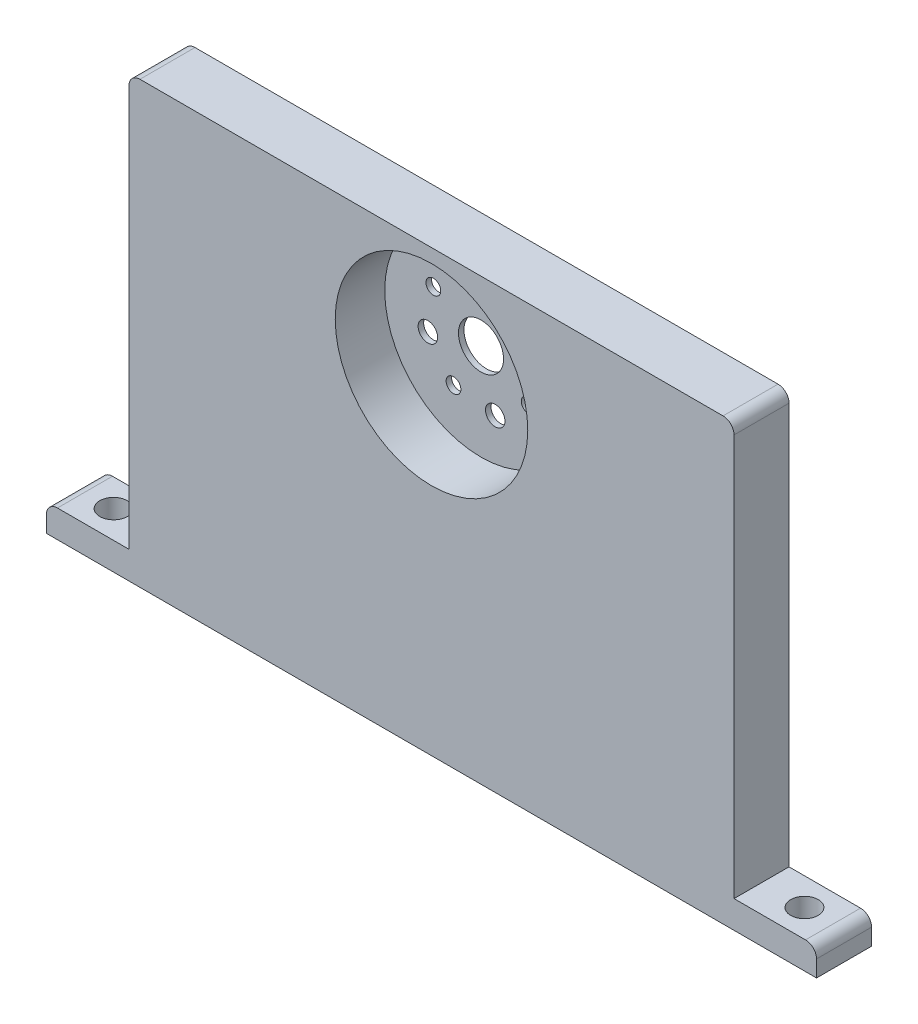
ISO-10303-21;
HEADER;
FILE_DESCRIPTION(('STEP AP214'),'2;1');
FILE_NAME('part.step','',(''),(''),'','','');
FILE_SCHEMA(('AUTOMOTIVE_DESIGN { 1 0 10303 214 1 1 1 1 }'));
ENDSEC;
DATA;
#1=APPLICATION_CONTEXT('core data for automotive mechanical design processes');
#2=APPLICATION_PROTOCOL_DEFINITION('international standard','automotive_design',2000,#1);
#3=PRODUCT_CONTEXT('',#1,'mechanical');
#4=PRODUCT('Part','Part','',(#3));
#5=PRODUCT_RELATED_PRODUCT_CATEGORY('part','',(#4));
#6=PRODUCT_DEFINITION_FORMATION('','',#4);
#7=PRODUCT_DEFINITION_CONTEXT('part definition',#1,'design');
#8=PRODUCT_DEFINITION('design','',#6,#7);
#9=PRODUCT_DEFINITION_SHAPE('','',#8);
#10=(LENGTH_UNIT() NAMED_UNIT(*) SI_UNIT(.MILLI.,.METRE.));
#11=(NAMED_UNIT(*) PLANE_ANGLE_UNIT() SI_UNIT($,.RADIAN.));
#12=(NAMED_UNIT(*) SI_UNIT($,.STERADIAN.) SOLID_ANGLE_UNIT());
#13=UNCERTAINTY_MEASURE_WITH_UNIT(LENGTH_MEASURE(1.E-05),#10,'distance_accuracy_value','');
#14=(GEOMETRIC_REPRESENTATION_CONTEXT(3) GLOBAL_UNCERTAINTY_ASSIGNED_CONTEXT((#13)) GLOBAL_UNIT_ASSIGNED_CONTEXT((#10,
#11,#12)) REPRESENTATION_CONTEXT('',''));
#15=CARTESIAN_POINT('',(0.,0.,0.));
#16=DIRECTION('',(0.,0.,1.));
#17=DIRECTION('',(1.,0.,0.));
#18=AXIS2_PLACEMENT_3D('',#15,#16,#17);
#19=CARTESIAN_POINT('',(69.85,76.2,-12.701));
#20=DIRECTION('',(0.,0.,1.));
#21=DIRECTION('',(1.,0.,0.));
#22=AXIS2_PLACEMENT_3D('',#19,#20,#21);
#23=CYLINDRICAL_SURFACE('',#22,5.20700000000001);
#24=CARTESIAN_POINT('',(69.85,76.2,-12.7));
#25=DIRECTION('',(0.,0.,1.));
#26=DIRECTION('',(1.,0.,0.));
#27=AXIS2_PLACEMENT_3D('',#24,#25,#26);
#28=CIRCLE('',#27,5.20700000000001);
#29=CARTESIAN_POINT('',(75.057,76.2,-12.7));
#30=VERTEX_POINT('',#29);
#31=EDGE_CURVE('E156',#30,#30,#28,.F.);
#32=ORIENTED_EDGE('',*,*,#31,.T.);
#33=EDGE_LOOP('',(#32));
#34=FACE_BOUND('',#33,.T.);
#35=CARTESIAN_POINT('',(69.85,76.2,-11.43));
#36=DIRECTION('',(0.,0.,1.));
#37=DIRECTION('',(1.,0.,0.));
#38=AXIS2_PLACEMENT_3D('',#35,#36,#37);
#39=CIRCLE('',#38,5.20700000000001);
#40=CARTESIAN_POINT('',(75.057,76.2,-11.43));
#41=VERTEX_POINT('',#40);
#42=EDGE_CURVE('E191',#41,#41,#39,.F.);
#43=ORIENTED_EDGE('',*,*,#42,.F.);
#44=EDGE_LOOP('',(#43));
#45=FACE_BOUND('',#44,.T.);
#46=ADVANCED_FACE('F35',(#34,#45),#23,.F.);
#47=CARTESIAN_POINT('',(0.,101.6,0.));
#48=DIRECTION('',(1.,0.,0.));
#49=DIRECTION('',(0.,0.,-1.));
#50=AXIS2_PLACEMENT_3D('',#47,#48,#49);
#51=PLANE('',#50);
#52=DIRECTION('',(0.,-1.,0.));
#53=VECTOR('',#52,1.);
#54=CARTESIAN_POINT('',(0.,101.6,0.));
#55=LINE('',#54,#53);
#56=CARTESIAN_POINT('',(0.,99.06,0.));
#57=VERTEX_POINT('',#56);
#58=CARTESIAN_POINT('',(0.,6.34999999999999,0.));
#59=VERTEX_POINT('',#58);
#60=EDGE_CURVE('E187',#57,#59,#55,.T.);
#61=ORIENTED_EDGE('',*,*,#60,.F.);
#62=DIRECTION('',(0.,0.,1.));
#63=VECTOR('',#62,1.);
#64=CARTESIAN_POINT('',(0.,99.06,0.));
#65=LINE('',#64,#63);
#66=CARTESIAN_POINT('',(0.,99.06,-12.7));
#67=VERTEX_POINT('',#66);
#68=EDGE_CURVE('E11',#57,#67,#65,.F.);
#69=ORIENTED_EDGE('',*,*,#68,.T.);
#70=DIRECTION('',(0.,-1.,0.));
#71=VECTOR('',#70,1.);
#72=CARTESIAN_POINT('',(0.,101.6,-12.7));
#73=LINE('',#72,#71);
#74=CARTESIAN_POINT('',(0.,6.34999999999999,-12.7));
#75=VERTEX_POINT('',#74);
#76=EDGE_CURVE('E179',#67,#75,#73,.T.);
#77=ORIENTED_EDGE('',*,*,#76,.T.);
#78=DIRECTION('',(0.,0.,-1.));
#79=VECTOR('',#78,1.);
#80=CARTESIAN_POINT('',(0.,6.35,0.));
#81=LINE('',#80,#79);
#82=EDGE_CURVE('E162',#59,#75,#81,.T.);
#83=ORIENTED_EDGE('',*,*,#82,.F.);
#84=EDGE_LOOP('',(#61,#69,#77,#83));
#85=FACE_BOUND('',#84,.T.);
#86=ADVANCED_FACE('F248',(#85),#51,.F.);
#87=CARTESIAN_POINT('',(0.,101.6,0.));
#88=DIRECTION('',(0.,0.,-1.));
#89=DIRECTION('',(-1.,0.,0.));
#90=AXIS2_PLACEMENT_3D('',#87,#88,#89);
#91=PLANE('',#90);
#92=CARTESIAN_POINT('',(69.85,76.2,0.));
#93=DIRECTION('',(0.,0.,1.));
#94=DIRECTION('',(1.,0.,0.));
#95=AXIS2_PLACEMENT_3D('',#92,#93,#94);
#96=CIRCLE('',#95,22.225);
#97=CARTESIAN_POINT('',(92.075,76.2,0.));
#98=VERTEX_POINT('',#97);
#99=EDGE_CURVE('E395',#98,#98,#96,.T.);
#100=ORIENTED_EDGE('',*,*,#99,.F.);
#101=EDGE_LOOP('',(#100));
#102=FACE_BOUND('',#101,.T.);
#103=DIRECTION('',(0.,1.,0.));
#104=VECTOR('',#103,1.);
#105=CARTESIAN_POINT('',(158.75,0.,0.));
#106=LINE('',#105,#104);
#107=CARTESIAN_POINT('',(158.75,0.,0.));
#108=VERTEX_POINT('',#107);
#109=CARTESIAN_POINT('',(158.75,3.81,0.));
#110=VERTEX_POINT('',#109);
#111=EDGE_CURVE('E126',#108,#110,#106,.T.);
#112=ORIENTED_EDGE('',*,*,#111,.T.);
#113=CARTESIAN_POINT('',(156.21,3.81,0.));
#114=DIRECTION('',(0.,0.,-1.));
#115=DIRECTION('',(-1.,0.,0.));
#116=AXIS2_PLACEMENT_3D('',#113,#114,#115);
#117=CIRCLE('',#116,2.54);
#118=CARTESIAN_POINT('',(156.21,6.35,0.));
#119=VERTEX_POINT('',#118);
#120=EDGE_CURVE('E211',#110,#119,#117,.F.);
#121=ORIENTED_EDGE('',*,*,#120,.T.);
#122=DIRECTION('',(-1.,0.,0.));
#123=VECTOR('',#122,1.);
#124=CARTESIAN_POINT('',(158.75,6.35,0.));
#125=LINE('',#124,#123);
#126=CARTESIAN_POINT('',(139.7,6.35,0.));
#127=VERTEX_POINT('',#126);
#128=EDGE_CURVE('E150',#119,#127,#125,.T.);
#129=ORIENTED_EDGE('',*,*,#128,.T.);
#130=DIRECTION('',(0.,-1.,0.));
#131=VECTOR('',#130,1.);
#132=CARTESIAN_POINT('',(139.7,101.6,0.));
#133=LINE('',#132,#131);
#134=CARTESIAN_POINT('',(139.7,99.06,0.));
#135=VERTEX_POINT('',#134);
#136=EDGE_CURVE('E185',#135,#127,#133,.T.);
#137=ORIENTED_EDGE('',*,*,#136,.F.);
#138=CARTESIAN_POINT('',(137.16,99.06,0.));
#139=DIRECTION('',(0.,0.,-1.));
#140=DIRECTION('',(-1.,0.,0.));
#141=AXIS2_PLACEMENT_3D('',#138,#139,#140);
#142=CIRCLE('',#141,2.54);
#143=CARTESIAN_POINT('',(137.16,101.6,0.));
#144=VERTEX_POINT('',#143);
#145=EDGE_CURVE('E208',#135,#144,#142,.F.);
#146=ORIENTED_EDGE('',*,*,#145,.T.);
#147=DIRECTION('',(1.,0.,0.));
#148=VECTOR('',#147,1.);
#149=CARTESIAN_POINT('',(0.,101.6,0.));
#150=LINE('',#149,#148);
#151=CARTESIAN_POINT('',(2.54,101.6,0.));
#152=VERTEX_POINT('',#151);
#153=EDGE_CURVE('E174',#152,#144,#150,.T.);
#154=ORIENTED_EDGE('',*,*,#153,.F.);
#155=CARTESIAN_POINT('',(2.54,99.06,0.));
#156=DIRECTION('',(0.,0.,-1.));
#157=DIRECTION('',(-1.,0.,0.));
#158=AXIS2_PLACEMENT_3D('',#155,#156,#157);
#159=CIRCLE('',#158,2.54);
#160=EDGE_CURVE('E206',#152,#57,#159,.F.);
#161=ORIENTED_EDGE('',*,*,#160,.T.);
#162=ORIENTED_EDGE('',*,*,#60,.T.);
#163=DIRECTION('',(1.,0.,0.));
#164=VECTOR('',#163,1.);
#165=CARTESIAN_POINT('',(-19.05,6.35,0.));
#166=LINE('',#165,#164);
#167=CARTESIAN_POINT('',(-16.51,6.35,0.));
#168=VERTEX_POINT('',#167);
#169=EDGE_CURVE('E134',#168,#59,#166,.T.);
#170=ORIENTED_EDGE('',*,*,#169,.F.);
#171=CARTESIAN_POINT('',(-16.51,3.81,0.));
#172=DIRECTION('',(0.,0.,-1.));
#173=DIRECTION('',(-1.,0.,0.));
#174=AXIS2_PLACEMENT_3D('',#171,#172,#173);
#175=CIRCLE('',#174,2.54);
#176=CARTESIAN_POINT('',(-19.05,3.81,0.));
#177=VERTEX_POINT('',#176);
#178=EDGE_CURVE('E50',#168,#177,#175,.F.);
#179=ORIENTED_EDGE('',*,*,#178,.T.);
#180=DIRECTION('',(0.,1.,0.));
#181=VECTOR('',#180,1.);
#182=CARTESIAN_POINT('',(-19.05,0.,0.));
#183=LINE('',#182,#181);
#184=CARTESIAN_POINT('',(-19.05,0.,0.));
#185=VERTEX_POINT('',#184);
#186=EDGE_CURVE('E128',#185,#177,#183,.T.);
#187=ORIENTED_EDGE('',*,*,#186,.F.);
#188=DIRECTION('',(1.,0.,0.));
#189=VECTOR('',#188,1.);
#190=CARTESIAN_POINT('',(0.,0.,0.));
#191=LINE('',#190,#189);
#192=EDGE_CURVE('E123',#185,#108,#191,.T.);
#193=ORIENTED_EDGE('',*,*,#192,.T.);
#194=EDGE_LOOP('',(#112,#121,#129,#137,#146,#154,#161,#162,#170,#179,#187,#193));
#195=FACE_BOUND('',#194,.T.);
#196=ADVANCED_FACE('F125',(#102,#195),#91,.F.);
#197=CARTESIAN_POINT('',(139.7,101.6,0.));
#198=DIRECTION('',(-1.,0.,0.));
#199=DIRECTION('',(0.,0.,1.));
#200=AXIS2_PLACEMENT_3D('',#197,#198,#199);
#201=PLANE('',#200);
#202=DIRECTION('',(0.,-1.,0.));
#203=VECTOR('',#202,1.);
#204=CARTESIAN_POINT('',(139.7,101.6,-12.7));
#205=LINE('',#204,#203);
#206=CARTESIAN_POINT('',(139.7,99.06,-12.7));
#207=VERTEX_POINT('',#206);
#208=CARTESIAN_POINT('',(139.7,6.34999999999999,-12.7));
#209=VERTEX_POINT('',#208);
#210=EDGE_CURVE('E183',#207,#209,#205,.T.);
#211=ORIENTED_EDGE('',*,*,#210,.F.);
#212=DIRECTION('',(0.,0.,-1.));
#213=VECTOR('',#212,1.);
#214=CARTESIAN_POINT('',(139.7,99.06,0.));
#215=LINE('',#214,#213);
#216=EDGE_CURVE('E43',#207,#135,#215,.F.);
#217=ORIENTED_EDGE('',*,*,#216,.T.);
#218=ORIENTED_EDGE('',*,*,#136,.T.);
#219=DIRECTION('',(0.,0.,-1.));
#220=VECTOR('',#219,1.);
#221=CARTESIAN_POINT('',(139.7,6.35,0.));
#222=LINE('',#221,#220);
#223=EDGE_CURVE('E143',#127,#209,#222,.T.);
#224=ORIENTED_EDGE('',*,*,#223,.T.);
#225=EDGE_LOOP('',(#211,#217,#218,#224));
#226=FACE_BOUND('',#225,.T.);
#227=ADVANCED_FACE('F226',(#226),#201,.F.);
#228=CARTESIAN_POINT('',(0.,101.6,-12.7));
#229=DIRECTION('',(0.,0.,1.));
#230=DIRECTION('',(1.,0.,0.));
#231=AXIS2_PLACEMENT_3D('',#228,#229,#230);
#232=PLANE('',#231);
#233=CARTESIAN_POINT('',(66.5629981271979,88.4672579938711,-12.7));
#234=DIRECTION('',(0.,0.,1.));
#235=DIRECTION('',(1.,0.,0.));
#236=AXIS2_PLACEMENT_3D('',#233,#234,#235);
#237=CIRCLE('',#236,2.24789999999996);
#238=CARTESIAN_POINT('',(68.8108981271979,88.4672579938711,-12.7));
#239=VERTEX_POINT('',#238);
#240=EDGE_CURVE('E369',#239,#239,#237,.F.);
#241=ORIENTED_EDGE('',*,*,#240,.F.);
#242=EDGE_LOOP('',(#241));
#243=FACE_BOUND('',#242,.T.);
#244=CARTESIAN_POINT('',(82.1172579938711,79.4870018728021,-12.7));
#245=DIRECTION('',(0.,0.,1.));
#246=DIRECTION('',(1.,0.,0.));
#247=AXIS2_PLACEMENT_3D('',#244,#245,#246);
#248=CIRCLE('',#247,2.24789999999986);
#249=CARTESIAN_POINT('',(84.365157993871,79.4870018728021,-12.7));
#250=VERTEX_POINT('',#249);
#251=EDGE_CURVE('E370',#250,#250,#248,.F.);
#252=ORIENTED_EDGE('',*,*,#251,.F.);
#253=EDGE_LOOP('',(#252));
#254=FACE_BOUND('',#253,.T.);
#255=CARTESIAN_POINT('',(73.1370018728021,63.9327420061289,-12.7));
#256=DIRECTION('',(0.,0.,1.));
#257=DIRECTION('',(1.,0.,0.));
#258=AXIS2_PLACEMENT_3D('',#255,#256,#257);
#259=CIRCLE('',#258,2.24789999999999);
#260=CARTESIAN_POINT('',(75.3849018728021,63.9327420061289,-12.7));
#261=VERTEX_POINT('',#260);
#262=EDGE_CURVE('E377',#261,#261,#259,.F.);
#263=ORIENTED_EDGE('',*,*,#262,.F.);
#264=EDGE_LOOP('',(#263));
#265=FACE_BOUND('',#264,.T.);
#266=CARTESIAN_POINT('',(57.5827420061288,72.9129981271979,-12.7));
#267=DIRECTION('',(0.,0.,1.));
#268=DIRECTION('',(1.,0.,0.));
#269=AXIS2_PLACEMENT_3D('',#266,#267,#268);
#270=CIRCLE('',#269,2.24789999999992);
#271=CARTESIAN_POINT('',(59.8306420061288,72.9129981271979,-12.7));
#272=VERTEX_POINT('',#271);
#273=EDGE_CURVE('E383',#272,#272,#270,.F.);
#274=ORIENTED_EDGE('',*,*,#273,.F.);
#275=EDGE_LOOP('',(#274));
#276=FACE_BOUND('',#275,.T.);
#277=CARTESIAN_POINT('',(76.1999999999999,87.1985226280624,-12.7));
#278=DIRECTION('',(0.,0.,1.));
#279=DIRECTION('',(1.,0.,0.));
#280=AXIS2_PLACEMENT_3D('',#277,#278,#279);
#281=CIRCLE('',#280,1.70179999999997);
#282=CARTESIAN_POINT('',(77.9017999999999,87.1985226280624,-12.7));
#283=VERTEX_POINT('',#282);
#284=EDGE_CURVE('E351',#283,#283,#281,.F.);
#285=ORIENTED_EDGE('',*,*,#284,.F.);
#286=EDGE_LOOP('',(#285));
#287=FACE_BOUND('',#286,.T.);
#288=CARTESIAN_POINT('',(80.8485226280624,69.8500000000001,-12.7));
#289=DIRECTION('',(0.,0.,1.));
#290=DIRECTION('',(1.,0.,0.));
#291=AXIS2_PLACEMENT_3D('',#288,#289,#290);
#292=CIRCLE('',#291,1.7018);
#293=CARTESIAN_POINT('',(82.5503226280624,69.8500000000001,-12.7));
#294=VERTEX_POINT('',#293);
#295=EDGE_CURVE('E352',#294,#294,#292,.F.);
#296=ORIENTED_EDGE('',*,*,#295,.F.);
#297=EDGE_LOOP('',(#296));
#298=FACE_BOUND('',#297,.T.);
#299=CARTESIAN_POINT('',(63.5,65.2014773719376,-12.7));
#300=DIRECTION('',(0.,0.,1.));
#301=DIRECTION('',(1.,0.,0.));
#302=AXIS2_PLACEMENT_3D('',#299,#300,#301);
#303=CIRCLE('',#302,1.7018000000001);
#304=CARTESIAN_POINT('',(65.2018000000001,65.2014773719376,-12.7));
#305=VERTEX_POINT('',#304);
#306=EDGE_CURVE('E359',#305,#305,#303,.F.);
#307=ORIENTED_EDGE('',*,*,#306,.F.);
#308=EDGE_LOOP('',(#307));
#309=FACE_BOUND('',#308,.T.);
#310=CARTESIAN_POINT('',(58.8514773719376,82.5499999999999,-12.7));
#311=DIRECTION('',(0.,0.,1.));
#312=DIRECTION('',(1.,0.,0.));
#313=AXIS2_PLACEMENT_3D('',#310,#311,#312);
#314=CIRCLE('',#313,1.70179999999998);
#315=CARTESIAN_POINT('',(60.5532773719376,82.5499999999999,-12.7));
#316=VERTEX_POINT('',#315);
#317=EDGE_CURVE('E392',#316,#316,#314,.F.);
#318=ORIENTED_EDGE('',*,*,#317,.F.);
#319=EDGE_LOOP('',(#318));
#320=FACE_BOUND('',#319,.T.);
#321=ORIENTED_EDGE('',*,*,#31,.F.);
#322=EDGE_LOOP('',(#321));
#323=FACE_BOUND('',#322,.T.);
#324=DIRECTION('',(-1.,0.,0.));
#325=VECTOR('',#324,1.);
#326=CARTESIAN_POINT('',(158.75,6.34999999999999,-12.7));
#327=LINE('',#326,#325);
#328=CARTESIAN_POINT('',(156.21,6.34999999999999,-12.7));
#329=VERTEX_POINT('',#328);
#330=EDGE_CURVE('E159',#329,#209,#327,.T.);
#331=ORIENTED_EDGE('',*,*,#330,.F.);
#332=CARTESIAN_POINT('',(156.21,3.80999999999999,-12.7));
#333=DIRECTION('',(0.,0.,1.));
#334=DIRECTION('',(1.,0.,0.));
#335=AXIS2_PLACEMENT_3D('',#332,#333,#334);
#336=CIRCLE('',#335,2.54);
#337=CARTESIAN_POINT('',(158.75,3.80999999999999,-12.7));
#338=VERTEX_POINT('',#337);
#339=EDGE_CURVE('E203',#329,#338,#336,.F.);
#340=ORIENTED_EDGE('',*,*,#339,.T.);
#341=DIRECTION('',(0.,-1.,0.));
#342=VECTOR('',#341,1.);
#343=CARTESIAN_POINT('',(158.75,0.,-12.7));
#344=LINE('',#343,#342);
#345=CARTESIAN_POINT('',(158.75,0.,-12.7));
#346=VERTEX_POINT('',#345);
#347=EDGE_CURVE('E148',#338,#346,#344,.T.);
#348=ORIENTED_EDGE('',*,*,#347,.T.);
#349=DIRECTION('',(-1.,0.,0.));
#350=VECTOR('',#349,1.);
#351=CARTESIAN_POINT('',(0.,0.,-12.7));
#352=LINE('',#351,#350);
#353=CARTESIAN_POINT('',(-19.05,0.,-12.7));
#354=VERTEX_POINT('',#353);
#355=EDGE_CURVE('E133',#346,#354,#352,.T.);
#356=ORIENTED_EDGE('',*,*,#355,.T.);
#357=DIRECTION('',(0.,-1.,0.));
#358=VECTOR('',#357,1.);
#359=CARTESIAN_POINT('',(-19.05,0.,-12.7));
#360=LINE('',#359,#358);
#361=CARTESIAN_POINT('',(-19.05,3.80999999999999,-12.7));
#362=VERTEX_POINT('',#361);
#363=EDGE_CURVE('E164',#362,#354,#360,.T.);
#364=ORIENTED_EDGE('',*,*,#363,.F.);
#365=CARTESIAN_POINT('',(-16.51,3.80999999999999,-12.7));
#366=DIRECTION('',(0.,0.,1.));
#367=DIRECTION('',(1.,0.,0.));
#368=AXIS2_PLACEMENT_3D('',#365,#366,#367);
#369=CIRCLE('',#368,2.54);
#370=CARTESIAN_POINT('',(-16.51,6.34999999999999,-12.7));
#371=VERTEX_POINT('',#370);
#372=EDGE_CURVE('E201',#362,#371,#369,.F.);
#373=ORIENTED_EDGE('',*,*,#372,.T.);
#374=DIRECTION('',(1.,0.,0.));
#375=VECTOR('',#374,1.);
#376=CARTESIAN_POINT('',(-19.05,6.34999999999999,-12.7));
#377=LINE('',#376,#375);
#378=EDGE_CURVE('E168',#371,#75,#377,.T.);
#379=ORIENTED_EDGE('',*,*,#378,.T.);
#380=ORIENTED_EDGE('',*,*,#76,.F.);
#381=CARTESIAN_POINT('',(2.54,99.06,-12.7));
#382=DIRECTION('',(0.,0.,1.));
#383=DIRECTION('',(1.,0.,0.));
#384=AXIS2_PLACEMENT_3D('',#381,#382,#383);
#385=CIRCLE('',#384,2.54);
#386=CARTESIAN_POINT('',(2.54,101.6,-12.7));
#387=VERTEX_POINT('',#386);
#388=EDGE_CURVE('E197',#67,#387,#385,.F.);
#389=ORIENTED_EDGE('',*,*,#388,.T.);
#390=DIRECTION('',(-1.,0.,0.));
#391=VECTOR('',#390,1.);
#392=CARTESIAN_POINT('',(0.,101.6,-12.7));
#393=LINE('',#392,#391);
#394=CARTESIAN_POINT('',(137.16,101.6,-12.7));
#395=VERTEX_POINT('',#394);
#396=EDGE_CURVE('E177',#395,#387,#393,.T.);
#397=ORIENTED_EDGE('',*,*,#396,.F.);
#398=CARTESIAN_POINT('',(137.16,99.06,-12.7));
#399=DIRECTION('',(0.,0.,1.));
#400=DIRECTION('',(1.,0.,0.));
#401=AXIS2_PLACEMENT_3D('',#398,#399,#400);
#402=CIRCLE('',#401,2.54);
#403=EDGE_CURVE('E199',#395,#207,#402,.F.);
#404=ORIENTED_EDGE('',*,*,#403,.T.);
#405=ORIENTED_EDGE('',*,*,#210,.T.);
#406=EDGE_LOOP('',(#331,#340,#348,#356,#364,#373,#379,#380,#389,#397,#404,#405));
#407=FACE_BOUND('',#406,.T.);
#408=ADVANCED_FACE('F240',(#243,#254,#265,#276,#287,#298,#309,#320,#323,#407),#232,.F.);
#409=CARTESIAN_POINT('',(0.,101.6,0.));
#410=DIRECTION('',(0.,-1.,0.));
#411=DIRECTION('',(0.,0.,-1.));
#412=AXIS2_PLACEMENT_3D('',#409,#410,#411);
#413=PLANE('',#412);
#414=ORIENTED_EDGE('',*,*,#153,.T.);
#415=DIRECTION('',(0.,0.,-1.));
#416=VECTOR('',#415,1.);
#417=CARTESIAN_POINT('',(137.16,101.6,0.));
#418=LINE('',#417,#416);
#419=EDGE_CURVE('E220',#144,#395,#418,.T.);
#420=ORIENTED_EDGE('',*,*,#419,.T.);
#421=ORIENTED_EDGE('',*,*,#396,.T.);
#422=DIRECTION('',(0.,0.,1.));
#423=VECTOR('',#422,1.);
#424=CARTESIAN_POINT('',(2.54,101.6,0.));
#425=LINE('',#424,#423);
#426=EDGE_CURVE('E217',#387,#152,#425,.T.);
#427=ORIENTED_EDGE('',*,*,#426,.T.);
#428=EDGE_LOOP('',(#414,#420,#421,#427));
#429=FACE_BOUND('',#428,.T.);
#430=ADVANCED_FACE('F236',(#429),#413,.F.);
#431=CARTESIAN_POINT('',(0.,0.,0.));
#432=DIRECTION('',(0.,-1.,0.));
#433=DIRECTION('',(0.,0.,-1.));
#434=AXIS2_PLACEMENT_3D('',#431,#432,#433);
#435=PLANE('',#434);
#436=CARTESIAN_POINT('',(149.606,0.,-6.35));
#437=DIRECTION('',(0.,-1.,0.));
#438=DIRECTION('',(0.,0.,-1.));
#439=AXIS2_PLACEMENT_3D('',#436,#437,#438);
#440=CIRCLE('',#439,3.175);
#441=CARTESIAN_POINT('',(149.606,0.,-9.525));
#442=VERTEX_POINT('',#441);
#443=EDGE_CURVE('E335',#442,#442,#440,.T.);
#444=ORIENTED_EDGE('',*,*,#443,.F.);
#445=EDGE_LOOP('',(#444));
#446=FACE_BOUND('',#445,.T.);
#447=CARTESIAN_POINT('',(-9.906,0.,-6.35));
#448=DIRECTION('',(0.,-1.,0.));
#449=DIRECTION('',(0.,0.,-1.));
#450=AXIS2_PLACEMENT_3D('',#447,#448,#449);
#451=CIRCLE('',#450,3.175);
#452=CARTESIAN_POINT('',(-9.906,0.,-9.525));
#453=VERTEX_POINT('',#452);
#454=EDGE_CURVE('E339',#453,#453,#451,.F.);
#455=ORIENTED_EDGE('',*,*,#454,.T.);
#456=EDGE_LOOP('',(#455));
#457=FACE_BOUND('',#456,.T.);
#458=ORIENTED_EDGE('',*,*,#192,.F.);
#459=DIRECTION('',(0.,0.,1.));
#460=VECTOR('',#459,1.);
#461=CARTESIAN_POINT('',(-19.05,0.,0.));
#462=LINE('',#461,#460);
#463=EDGE_CURVE('E166',#354,#185,#462,.T.);
#464=ORIENTED_EDGE('',*,*,#463,.F.);
#465=ORIENTED_EDGE('',*,*,#355,.F.);
#466=DIRECTION('',(0.,0.,1.));
#467=VECTOR('',#466,1.);
#468=CARTESIAN_POINT('',(158.75,0.,0.));
#469=LINE('',#468,#467);
#470=EDGE_CURVE('E140',#346,#108,#469,.T.);
#471=ORIENTED_EDGE('',*,*,#470,.T.);
#472=EDGE_LOOP('',(#458,#464,#465,#471));
#473=FACE_BOUND('',#472,.T.);
#474=ADVANCED_FACE('F146',(#446,#457,#473),#435,.T.);
#475=CARTESIAN_POINT('',(-19.05,6.35,0.));
#476=DIRECTION('',(0.,-1.,0.));
#477=DIRECTION('',(0.,0.,-1.));
#478=AXIS2_PLACEMENT_3D('',#475,#476,#477);
#479=PLANE('',#478);
#480=CARTESIAN_POINT('',(-9.906,6.35,-6.35));
#481=DIRECTION('',(0.,1.,0.));
#482=DIRECTION('',(0.,0.,1.));
#483=AXIS2_PLACEMENT_3D('',#480,#481,#482);
#484=CIRCLE('',#483,3.175);
#485=CARTESIAN_POINT('',(-9.906,6.35,-3.175));
#486=VERTEX_POINT('',#485);
#487=EDGE_CURVE('E342',#486,#486,#484,.T.);
#488=ORIENTED_EDGE('',*,*,#487,.F.);
#489=EDGE_LOOP('',(#488));
#490=FACE_BOUND('',#489,.T.);
#491=ORIENTED_EDGE('',*,*,#378,.F.);
#492=DIRECTION('',(0.,0.,-1.));
#493=VECTOR('',#492,1.);
#494=CARTESIAN_POINT('',(-16.51,6.35,0.));
#495=LINE('',#494,#493);
#496=EDGE_CURVE('E58',#371,#168,#495,.F.);
#497=ORIENTED_EDGE('',*,*,#496,.T.);
#498=ORIENTED_EDGE('',*,*,#169,.T.);
#499=ORIENTED_EDGE('',*,*,#82,.T.);
#500=EDGE_LOOP('',(#491,#497,#498,#499));
#501=FACE_BOUND('',#500,.T.);
#502=ADVANCED_FACE('F249',(#490,#501),#479,.F.);
#503=CARTESIAN_POINT('',(-19.05,0.,0.));
#504=DIRECTION('',(-1.,0.,0.));
#505=DIRECTION('',(0.,0.,1.));
#506=AXIS2_PLACEMENT_3D('',#503,#504,#505);
#507=PLANE('',#506);
#508=ORIENTED_EDGE('',*,*,#186,.T.);
#509=DIRECTION('',(0.,0.,-1.));
#510=VECTOR('',#509,1.);
#511=CARTESIAN_POINT('',(-19.05,3.80999999999999,-12.7));
#512=LINE('',#511,#510);
#513=EDGE_CURVE('E213',#177,#362,#512,.T.);
#514=ORIENTED_EDGE('',*,*,#513,.T.);
#515=ORIENTED_EDGE('',*,*,#363,.T.);
#516=ORIENTED_EDGE('',*,*,#463,.T.);
#517=EDGE_LOOP('',(#508,#514,#515,#516));
#518=FACE_BOUND('',#517,.T.);
#519=ADVANCED_FACE('F255',(#518),#507,.T.);
#520=CARTESIAN_POINT('',(158.75,6.35,0.));
#521=DIRECTION('',(0.,1.,0.));
#522=DIRECTION('',(0.,0.,1.));
#523=AXIS2_PLACEMENT_3D('',#520,#521,#522);
#524=PLANE('',#523);
#525=CARTESIAN_POINT('',(149.606,6.35,-6.35));
#526=DIRECTION('',(0.,-1.,0.));
#527=DIRECTION('',(0.,0.,1.));
#528=AXIS2_PLACEMENT_3D('',#525,#526,#527);
#529=CIRCLE('',#528,3.175);
#530=CARTESIAN_POINT('',(149.606,6.35,-3.175));
#531=VERTEX_POINT('',#530);
#532=EDGE_CURVE('E337',#531,#531,#529,.T.);
#533=ORIENTED_EDGE('',*,*,#532,.T.);
#534=EDGE_LOOP('',(#533));
#535=FACE_BOUND('',#534,.T.);
#536=ORIENTED_EDGE('',*,*,#128,.F.);
#537=DIRECTION('',(0.,0.,-1.));
#538=VECTOR('',#537,1.);
#539=CARTESIAN_POINT('',(156.21,6.35,0.));
#540=LINE('',#539,#538);
#541=EDGE_CURVE('E190',#119,#329,#540,.T.);
#542=ORIENTED_EDGE('',*,*,#541,.T.);
#543=ORIENTED_EDGE('',*,*,#330,.T.);
#544=ORIENTED_EDGE('',*,*,#223,.F.);
#545=EDGE_LOOP('',(#536,#542,#543,#544));
#546=FACE_BOUND('',#545,.T.);
#547=ADVANCED_FACE('F260',(#535,#546),#524,.T.);
#548=CARTESIAN_POINT('',(158.75,0.,0.));
#549=DIRECTION('',(1.,0.,0.));
#550=DIRECTION('',(0.,0.,1.));
#551=AXIS2_PLACEMENT_3D('',#548,#549,#550);
#552=PLANE('',#551);
#553=ORIENTED_EDGE('',*,*,#347,.F.);
#554=DIRECTION('',(0.,0.,-1.));
#555=VECTOR('',#554,1.);
#556=CARTESIAN_POINT('',(158.75,3.81,0.));
#557=LINE('',#556,#555);
#558=EDGE_CURVE('E142',#338,#110,#557,.F.);
#559=ORIENTED_EDGE('',*,*,#558,.T.);
#560=ORIENTED_EDGE('',*,*,#111,.F.);
#561=ORIENTED_EDGE('',*,*,#470,.F.);
#562=EDGE_LOOP('',(#553,#559,#560,#561));
#563=FACE_BOUND('',#562,.T.);
#564=ADVANCED_FACE('F139',(#563),#552,.T.);
#565=CARTESIAN_POINT('',(69.85,76.2,-11.43));
#566=DIRECTION('',(0.,0.,1.));
#567=DIRECTION('',(1.,0.,0.));
#568=AXIS2_PLACEMENT_3D('',#565,#566,#567);
#569=PLANE('',#568);
#570=CARTESIAN_POINT('',(66.5629981271979,88.4672579938711,-11.43));
#571=DIRECTION('',(0.,0.,1.));
#572=DIRECTION('',(1.,0.,0.));
#573=AXIS2_PLACEMENT_3D('',#570,#571,#572);
#574=CIRCLE('',#573,2.24789999999996);
#575=CARTESIAN_POINT('',(68.8108981271979,88.4672579938711,-11.43));
#576=VERTEX_POINT('',#575);
#577=EDGE_CURVE('E366',#576,#576,#574,.T.);
#578=ORIENTED_EDGE('',*,*,#577,.F.);
#579=EDGE_LOOP('',(#578));
#580=FACE_BOUND('',#579,.T.);
#581=CARTESIAN_POINT('',(82.1172579938711,79.4870018728021,-11.43));
#582=DIRECTION('',(0.,0.,1.));
#583=DIRECTION('',(1.,0.,0.));
#584=AXIS2_PLACEMENT_3D('',#581,#582,#583);
#585=CIRCLE('',#584,2.24789999999986);
#586=CARTESIAN_POINT('',(84.365157993871,79.4870018728021,-11.43));
#587=VERTEX_POINT('',#586);
#588=EDGE_CURVE('E374',#587,#587,#585,.T.);
#589=ORIENTED_EDGE('',*,*,#588,.F.);
#590=EDGE_LOOP('',(#589));
#591=FACE_BOUND('',#590,.T.);
#592=CARTESIAN_POINT('',(73.1370018728021,63.9327420061289,-11.43));
#593=DIRECTION('',(0.,0.,1.));
#594=DIRECTION('',(1.,0.,0.));
#595=AXIS2_PLACEMENT_3D('',#592,#593,#594);
#596=CIRCLE('',#595,2.24789999999999);
#597=CARTESIAN_POINT('',(75.3849018728021,63.9327420061289,-11.43));
#598=VERTEX_POINT('',#597);
#599=EDGE_CURVE('E380',#598,#598,#596,.T.);
#600=ORIENTED_EDGE('',*,*,#599,.F.);
#601=EDGE_LOOP('',(#600));
#602=FACE_BOUND('',#601,.T.);
#603=CARTESIAN_POINT('',(57.5827420061288,72.9129981271979,-11.43));
#604=DIRECTION('',(0.,0.,1.));
#605=DIRECTION('',(1.,0.,0.));
#606=AXIS2_PLACEMENT_3D('',#603,#604,#605);
#607=CIRCLE('',#606,2.24789999999992);
#608=CARTESIAN_POINT('',(59.8306420061288,72.9129981271979,-11.43));
#609=VERTEX_POINT('',#608);
#610=EDGE_CURVE('E355',#609,#609,#607,.T.);
#611=ORIENTED_EDGE('',*,*,#610,.F.);
#612=EDGE_LOOP('',(#611));
#613=FACE_BOUND('',#612,.T.);
#614=CARTESIAN_POINT('',(76.1999999999999,87.1985226280624,-11.43));
#615=DIRECTION('',(0.,0.,1.));
#616=DIRECTION('',(1.,0.,0.));
#617=AXIS2_PLACEMENT_3D('',#614,#615,#616);
#618=CIRCLE('',#617,1.70179999999997);
#619=CARTESIAN_POINT('',(77.9017999999999,87.1985226280624,-11.43));
#620=VERTEX_POINT('',#619);
#621=EDGE_CURVE('E348',#620,#620,#618,.T.);
#622=ORIENTED_EDGE('',*,*,#621,.F.);
#623=EDGE_LOOP('',(#622));
#624=FACE_BOUND('',#623,.T.);
#625=CARTESIAN_POINT('',(80.8485226280624,69.8500000000001,-11.43));
#626=DIRECTION('',(0.,0.,1.));
#627=DIRECTION('',(1.,0.,0.));
#628=AXIS2_PLACEMENT_3D('',#625,#626,#627);
#629=CIRCLE('',#628,1.7018);
#630=CARTESIAN_POINT('',(82.5503226280624,69.8500000000001,-11.43));
#631=VERTEX_POINT('',#630);
#632=EDGE_CURVE('E356',#631,#631,#629,.T.);
#633=ORIENTED_EDGE('',*,*,#632,.F.);
#634=EDGE_LOOP('',(#633));
#635=FACE_BOUND('',#634,.T.);
#636=CARTESIAN_POINT('',(63.5,65.2014773719376,-11.43));
#637=DIRECTION('',(0.,0.,1.));
#638=DIRECTION('',(1.,0.,0.));
#639=AXIS2_PLACEMENT_3D('',#636,#637,#638);
#640=CIRCLE('',#639,1.7018000000001);
#641=CARTESIAN_POINT('',(65.2018000000001,65.2014773719376,-11.43));
#642=VERTEX_POINT('',#641);
#643=EDGE_CURVE('E345',#642,#642,#640,.T.);
#644=ORIENTED_EDGE('',*,*,#643,.F.);
#645=EDGE_LOOP('',(#644));
#646=FACE_BOUND('',#645,.T.);
#647=CARTESIAN_POINT('',(58.8514773719376,82.5499999999999,-11.43));
#648=DIRECTION('',(0.,0.,1.));
#649=DIRECTION('',(1.,0.,0.));
#650=AXIS2_PLACEMENT_3D('',#647,#648,#649);
#651=CIRCLE('',#650,1.70179999999998);
#652=CARTESIAN_POINT('',(60.5532773719376,82.5499999999999,-11.43));
#653=VERTEX_POINT('',#652);
#654=EDGE_CURVE('E373',#653,#653,#651,.T.);
#655=ORIENTED_EDGE('',*,*,#654,.F.);
#656=EDGE_LOOP('',(#655));
#657=FACE_BOUND('',#656,.T.);
#658=CARTESIAN_POINT('',(69.85,76.2,-11.43));
#659=DIRECTION('',(0.,0.,1.));
#660=DIRECTION('',(1.,0.,0.));
#661=AXIS2_PLACEMENT_3D('',#658,#659,#660);
#662=CIRCLE('',#661,22.225);
#663=CARTESIAN_POINT('',(92.075,76.2,-11.43));
#664=VERTEX_POINT('',#663);
#665=EDGE_CURVE('E194',#664,#664,#662,.T.);
#666=ORIENTED_EDGE('',*,*,#665,.T.);
#667=EDGE_LOOP('',(#666));
#668=FACE_BOUND('',#667,.T.);
#669=ORIENTED_EDGE('',*,*,#42,.T.);
#670=EDGE_LOOP('',(#669));
#671=FACE_BOUND('',#670,.T.);
#672=ADVANCED_FACE('F268',(#580,#591,#602,#613,#624,#635,#646,#657,#668,#671),#569,.T.);
#673=CARTESIAN_POINT('',(69.85,76.2,-11.43));
#674=DIRECTION('',(0.,0.,1.));
#675=DIRECTION('',(1.,0.,0.));
#676=AXIS2_PLACEMENT_3D('',#673,#674,#675);
#677=CYLINDRICAL_SURFACE('',#676,22.225);
#678=ORIENTED_EDGE('',*,*,#665,.F.);
#679=EDGE_LOOP('',(#678));
#680=FACE_BOUND('',#679,.T.);
#681=ORIENTED_EDGE('',*,*,#99,.T.);
#682=EDGE_LOOP('',(#681));
#683=FACE_BOUND('',#682,.T.);
#684=ADVANCED_FACE('F282',(#680,#683),#677,.F.);
#685=CARTESIAN_POINT('',(58.8514773719376,82.5499999999999,-12.701));
#686=DIRECTION('',(0.,0.,1.));
#687=DIRECTION('',(1.,0.,0.));
#688=AXIS2_PLACEMENT_3D('',#685,#686,#687);
#689=CYLINDRICAL_SURFACE('',#688,1.70179999999998);
#690=ORIENTED_EDGE('',*,*,#654,.T.);
#691=EDGE_LOOP('',(#690));
#692=FACE_BOUND('',#691,.T.);
#693=ORIENTED_EDGE('',*,*,#317,.T.);
#694=EDGE_LOOP('',(#693));
#695=FACE_BOUND('',#694,.T.);
#696=ADVANCED_FACE('F285',(#692,#695),#689,.F.);
#697=CARTESIAN_POINT('',(63.5,65.2014773719376,-12.701));
#698=DIRECTION('',(0.,0.,1.));
#699=DIRECTION('',(1.,0.,0.));
#700=AXIS2_PLACEMENT_3D('',#697,#698,#699);
#701=CYLINDRICAL_SURFACE('',#700,1.7018000000001);
#702=ORIENTED_EDGE('',*,*,#643,.T.);
#703=EDGE_LOOP('',(#702));
#704=FACE_BOUND('',#703,.T.);
#705=ORIENTED_EDGE('',*,*,#306,.T.);
#706=EDGE_LOOP('',(#705));
#707=FACE_BOUND('',#706,.T.);
#708=ADVANCED_FACE('F292',(#704,#707),#701,.F.);
#709=CARTESIAN_POINT('',(80.8485226280624,69.8500000000001,-12.701));
#710=DIRECTION('',(0.,0.,1.));
#711=DIRECTION('',(1.,0.,0.));
#712=AXIS2_PLACEMENT_3D('',#709,#710,#711);
#713=CYLINDRICAL_SURFACE('',#712,1.7018);
#714=ORIENTED_EDGE('',*,*,#632,.T.);
#715=EDGE_LOOP('',(#714));
#716=FACE_BOUND('',#715,.T.);
#717=ORIENTED_EDGE('',*,*,#295,.T.);
#718=EDGE_LOOP('',(#717));
#719=FACE_BOUND('',#718,.T.);
#720=ADVANCED_FACE('F314',(#716,#719),#713,.F.);
#721=CARTESIAN_POINT('',(76.1999999999999,87.1985226280624,-12.701));
#722=DIRECTION('',(0.,0.,1.));
#723=DIRECTION('',(1.,0.,0.));
#724=AXIS2_PLACEMENT_3D('',#721,#722,#723);
#725=CYLINDRICAL_SURFACE('',#724,1.70179999999997);
#726=ORIENTED_EDGE('',*,*,#621,.T.);
#727=EDGE_LOOP('',(#726));
#728=FACE_BOUND('',#727,.T.);
#729=ORIENTED_EDGE('',*,*,#284,.T.);
#730=EDGE_LOOP('',(#729));
#731=FACE_BOUND('',#730,.T.);
#732=ADVANCED_FACE('F298',(#728,#731),#725,.F.);
#733=CARTESIAN_POINT('',(57.5827420061288,72.9129981271979,-12.701));
#734=DIRECTION('',(0.,0.,1.));
#735=DIRECTION('',(1.,0.,0.));
#736=AXIS2_PLACEMENT_3D('',#733,#734,#735);
#737=CYLINDRICAL_SURFACE('',#736,2.24789999999992);
#738=ORIENTED_EDGE('',*,*,#610,.T.);
#739=EDGE_LOOP('',(#738));
#740=FACE_BOUND('',#739,.T.);
#741=ORIENTED_EDGE('',*,*,#273,.T.);
#742=EDGE_LOOP('',(#741));
#743=FACE_BOUND('',#742,.T.);
#744=ADVANCED_FACE('F294',(#740,#743),#737,.F.);
#745=CARTESIAN_POINT('',(73.1370018728021,63.9327420061289,-12.701));
#746=DIRECTION('',(0.,0.,1.));
#747=DIRECTION('',(1.,0.,0.));
#748=AXIS2_PLACEMENT_3D('',#745,#746,#747);
#749=CYLINDRICAL_SURFACE('',#748,2.24789999999999);
#750=ORIENTED_EDGE('',*,*,#599,.T.);
#751=EDGE_LOOP('',(#750));
#752=FACE_BOUND('',#751,.T.);
#753=ORIENTED_EDGE('',*,*,#262,.T.);
#754=EDGE_LOOP('',(#753));
#755=FACE_BOUND('',#754,.T.);
#756=ADVANCED_FACE('F297',(#752,#755),#749,.F.);
#757=CARTESIAN_POINT('',(82.1172579938711,79.4870018728021,-12.701));
#758=DIRECTION('',(0.,0.,1.));
#759=DIRECTION('',(1.,0.,0.));
#760=AXIS2_PLACEMENT_3D('',#757,#758,#759);
#761=CYLINDRICAL_SURFACE('',#760,2.24789999999986);
#762=ORIENTED_EDGE('',*,*,#588,.T.);
#763=EDGE_LOOP('',(#762));
#764=FACE_BOUND('',#763,.T.);
#765=ORIENTED_EDGE('',*,*,#251,.T.);
#766=EDGE_LOOP('',(#765));
#767=FACE_BOUND('',#766,.T.);
#768=ADVANCED_FACE('F302',(#764,#767),#761,.F.);
#769=CARTESIAN_POINT('',(66.5629981271979,88.4672579938711,-12.701));
#770=DIRECTION('',(0.,0.,1.));
#771=DIRECTION('',(1.,0.,0.));
#772=AXIS2_PLACEMENT_3D('',#769,#770,#771);
#773=CYLINDRICAL_SURFACE('',#772,2.24789999999996);
#774=ORIENTED_EDGE('',*,*,#577,.T.);
#775=EDGE_LOOP('',(#774));
#776=FACE_BOUND('',#775,.T.);
#777=ORIENTED_EDGE('',*,*,#240,.T.);
#778=EDGE_LOOP('',(#777));
#779=FACE_BOUND('',#778,.T.);
#780=ADVANCED_FACE('F306',(#776,#779),#773,.F.);
#781=CARTESIAN_POINT('',(-9.906,-0.0010000000000036,-6.35));
#782=DIRECTION('',(0.,1.,0.));
#783=DIRECTION('',(0.,0.,1.));
#784=AXIS2_PLACEMENT_3D('',#781,#782,#783);
#785=CYLINDRICAL_SURFACE('',#784,3.175);
#786=ORIENTED_EDGE('',*,*,#454,.F.);
#787=EDGE_LOOP('',(#786));
#788=FACE_BOUND('',#787,.T.);
#789=ORIENTED_EDGE('',*,*,#487,.T.);
#790=EDGE_LOOP('',(#789));
#791=FACE_BOUND('',#790,.T.);
#792=ADVANCED_FACE('F310',(#788,#791),#785,.F.);
#793=CARTESIAN_POINT('',(149.606,-0.0010000000000036,-6.35));
#794=DIRECTION('',(0.,1.,0.));
#795=DIRECTION('',(0.,0.,1.));
#796=AXIS2_PLACEMENT_3D('',#793,#794,#795);
#797=CYLINDRICAL_SURFACE('',#796,3.175);
#798=ORIENTED_EDGE('',*,*,#443,.T.);
#799=EDGE_LOOP('',(#798));
#800=FACE_BOUND('',#799,.T.);
#801=ORIENTED_EDGE('',*,*,#532,.F.);
#802=EDGE_LOOP('',(#801));
#803=FACE_BOUND('',#802,.T.);
#804=ADVANCED_FACE('F324',(#800,#803),#797,.F.);
#805=CARTESIAN_POINT('',(156.21,3.81,0.));
#806=DIRECTION('',(0.,0.,-1.));
#807=DIRECTION('',(0.,1.,0.));
#808=AXIS2_PLACEMENT_3D('',#805,#806,#807);
#809=CYLINDRICAL_SURFACE('',#808,2.54);
#810=ORIENTED_EDGE('',*,*,#120,.F.);
#811=ORIENTED_EDGE('',*,*,#558,.F.);
#812=ORIENTED_EDGE('',*,*,#339,.F.);
#813=ORIENTED_EDGE('',*,*,#541,.F.);
#814=EDGE_LOOP('',(#810,#811,#812,#813));
#815=FACE_BOUND('',#814,.T.);
#816=ADVANCED_FACE('F257',(#815),#809,.T.);
#817=CARTESIAN_POINT('',(-16.51,3.81,0.));
#818=DIRECTION('',(0.,0.,1.));
#819=DIRECTION('',(0.,-1.,0.));
#820=AXIS2_PLACEMENT_3D('',#817,#818,#819);
#821=CYLINDRICAL_SURFACE('',#820,2.54);
#822=ORIENTED_EDGE('',*,*,#178,.F.);
#823=ORIENTED_EDGE('',*,*,#496,.F.);
#824=ORIENTED_EDGE('',*,*,#372,.F.);
#825=ORIENTED_EDGE('',*,*,#513,.F.);
#826=EDGE_LOOP('',(#822,#823,#824,#825));
#827=FACE_BOUND('',#826,.T.);
#828=ADVANCED_FACE('F252',(#827),#821,.T.);
#829=CARTESIAN_POINT('',(137.16,99.06,0.));
#830=DIRECTION('',(0.,0.,-1.));
#831=DIRECTION('',(-1.,0.,0.));
#832=AXIS2_PLACEMENT_3D('',#829,#830,#831);
#833=CYLINDRICAL_SURFACE('',#832,2.54);
#834=ORIENTED_EDGE('',*,*,#145,.F.);
#835=ORIENTED_EDGE('',*,*,#216,.F.);
#836=ORIENTED_EDGE('',*,*,#403,.F.);
#837=ORIENTED_EDGE('',*,*,#419,.F.);
#838=EDGE_LOOP('',(#834,#835,#836,#837));
#839=FACE_BOUND('',#838,.T.);
#840=ADVANCED_FACE('F233',(#839),#833,.T.);
#841=CARTESIAN_POINT('',(2.54,99.06,0.));
#842=DIRECTION('',(0.,0.,1.));
#843=DIRECTION('',(1.,0.,0.));
#844=AXIS2_PLACEMENT_3D('',#841,#842,#843);
#845=CYLINDRICAL_SURFACE('',#844,2.54);
#846=ORIENTED_EDGE('',*,*,#388,.F.);
#847=ORIENTED_EDGE('',*,*,#68,.F.);
#848=ORIENTED_EDGE('',*,*,#160,.F.);
#849=ORIENTED_EDGE('',*,*,#426,.F.);
#850=EDGE_LOOP('',(#846,#847,#848,#849));
#851=FACE_BOUND('',#850,.T.);
#852=ADVANCED_FACE('F37',(#851),#845,.T.);
#853=CLOSED_SHELL('',(#46,#86,#196,#227,#408,#430,#474,#502,#519,#547,#564,#672,#684,#696,#708,
#720,#732,#744,#756,#768,#780,#792,#804,#816,#828,#840,#852));
#854=MANIFOLD_SOLID_BREP('B2',#853);
#855=ADVANCED_BREP_SHAPE_REPRESENTATION('',(#18,#854),#14);
#856=SHAPE_DEFINITION_REPRESENTATION(#9,#855);
ENDSEC;
END-ISO-10303-21;
